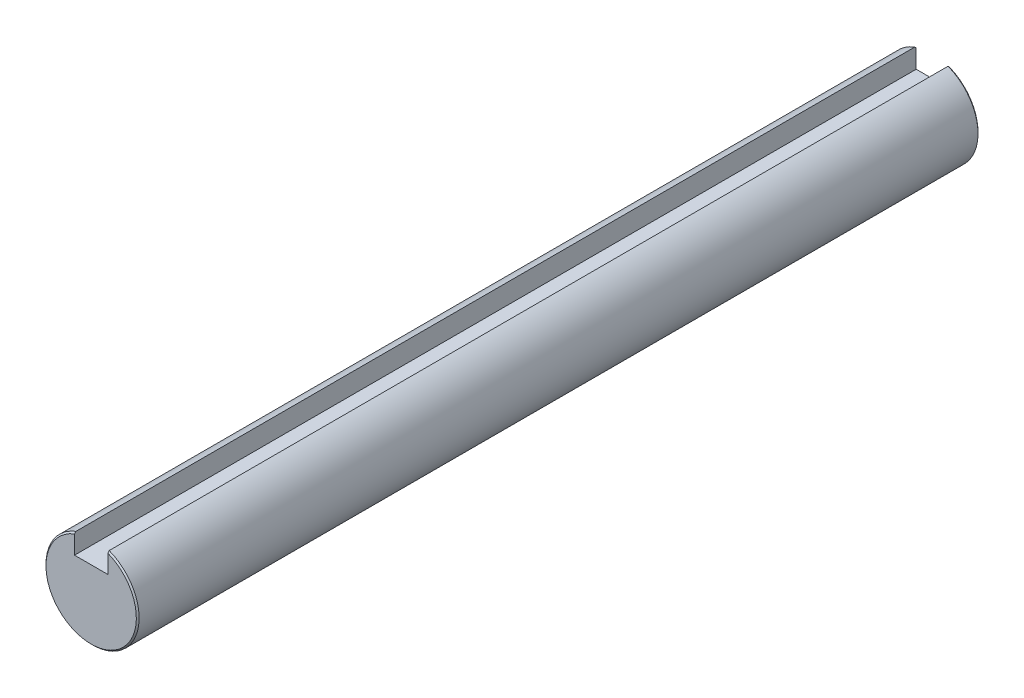
ISO-10303-21;
HEADER;
FILE_DESCRIPTION(('STEP AP214'),'2;1');
FILE_NAME('part.step','',(''),(''),'','','');
FILE_SCHEMA(('AUTOMOTIVE_DESIGN { 1 0 10303 214 1 1 1 1 }'));
ENDSEC;
DATA;
#1=APPLICATION_CONTEXT('core data for automotive mechanical design processes');
#2=APPLICATION_PROTOCOL_DEFINITION('international standard','automotive_design',2000,#1);
#3=PRODUCT_CONTEXT('',#1,'mechanical');
#4=PRODUCT('Part','Part','',(#3));
#5=PRODUCT_RELATED_PRODUCT_CATEGORY('part','',(#4));
#6=PRODUCT_DEFINITION_FORMATION('','',#4);
#7=PRODUCT_DEFINITION_CONTEXT('part definition',#1,'design');
#8=PRODUCT_DEFINITION('design','',#6,#7);
#9=PRODUCT_DEFINITION_SHAPE('','',#8);
#10=(LENGTH_UNIT() NAMED_UNIT(*) SI_UNIT(.MILLI.,.METRE.));
#11=(NAMED_UNIT(*) PLANE_ANGLE_UNIT() SI_UNIT($,.RADIAN.));
#12=(NAMED_UNIT(*) SI_UNIT($,.STERADIAN.) SOLID_ANGLE_UNIT());
#13=UNCERTAINTY_MEASURE_WITH_UNIT(LENGTH_MEASURE(1.E-05),#10,'distance_accuracy_value','');
#14=(GEOMETRIC_REPRESENTATION_CONTEXT(3) GLOBAL_UNCERTAINTY_ASSIGNED_CONTEXT((#13)) GLOBAL_UNIT_ASSIGNED_CONTEXT((#10,
#11,#12)) REPRESENTATION_CONTEXT('',''));
#15=CARTESIAN_POINT('',(0.,0.,0.));
#16=DIRECTION('',(0.,0.,1.));
#17=DIRECTION('',(1.,0.,0.));
#18=AXIS2_PLACEMENT_3D('',#15,#16,#17);
#19=CARTESIAN_POINT('',(0.,0.,63.25));
#20=DIRECTION('',(0.,0.,-1.));
#21=DIRECTION('',(-1.,0.,0.));
#22=AXIS2_PLACEMENT_3D('',#19,#20,#21);
#23=CYLINDRICAL_SURFACE('',#22,7.);
#24=DIRECTION('',(0.,0.,-1.));
#25=VECTOR('',#24,1.);
#26=CARTESIAN_POINT('',(-2.5,6.53834841531101,63.25));
#27=LINE('',#26,#25);
#28=CARTESIAN_POINT('',(-2.5,6.53834841531101,63.04));
#29=VERTEX_POINT('',#28);
#30=CARTESIAN_POINT('',(-2.5,6.53834841531101,-63.04));
#31=VERTEX_POINT('',#30);
#32=EDGE_CURVE('E133',#29,#31,#27,.T.);
#33=ORIENTED_EDGE('',*,*,#32,.T.);
#34=CARTESIAN_POINT('',(0.,0.,-63.04));
#35=DIRECTION('',(0.,0.,1.));
#36=DIRECTION('',(1.,0.,0.));
#37=AXIS2_PLACEMENT_3D('',#34,#35,#36);
#38=CIRCLE('',#37,7.);
#39=CARTESIAN_POINT('',(2.5,6.53834841531101,-63.04));
#40=VERTEX_POINT('',#39);
#41=EDGE_CURVE('E144',#31,#40,#38,.T.);
#42=ORIENTED_EDGE('',*,*,#41,.T.);
#43=DIRECTION('',(0.,0.,-1.));
#44=VECTOR('',#43,1.);
#45=CARTESIAN_POINT('',(2.5,6.53834841531101,63.25));
#46=LINE('',#45,#44);
#47=CARTESIAN_POINT('',(2.5,6.53834841531101,63.04));
#48=VERTEX_POINT('',#47);
#49=EDGE_CURVE('E115',#48,#40,#46,.T.);
#50=ORIENTED_EDGE('',*,*,#49,.F.);
#51=CARTESIAN_POINT('',(0.,0.,63.04));
#52=DIRECTION('',(0.,0.,1.));
#53=DIRECTION('',(1.,0.,0.));
#54=AXIS2_PLACEMENT_3D('',#51,#52,#53);
#55=CIRCLE('',#54,7.);
#56=EDGE_CURVE('E141',#48,#29,#55,.F.);
#57=ORIENTED_EDGE('',*,*,#56,.T.);
#58=EDGE_LOOP('',(#33,#42,#50,#57));
#59=FACE_BOUND('',#58,.T.);
#60=ADVANCED_FACE('F39',(#59),#23,.T.);
#61=CARTESIAN_POINT('',(2.5,3.53834841531101,63.25));
#62=DIRECTION('',(1.,0.,0.));
#63=DIRECTION('',(0.,0.,-1.));
#64=AXIS2_PLACEMENT_3D('',#61,#62,#63);
#65=PLANE('',#64);
#66=ORIENTED_EDGE('',*,*,#49,.T.);
#67=CARTESIAN_POINT('',(2.5,6.53834841531101,-63.04));
#68=CARTESIAN_POINT('',(2.5,6.50083232617843,-63.0750431903254));
#69=CARTESIAN_POINT('',(2.5,6.46329611171481,-63.1100647854001));
#70=CARTESIAN_POINT('',(2.5,6.38818343174731,-63.1800647854005));
#71=CARTESIAN_POINT('',(2.5,6.35060696624303,-63.2150431903258));
#72=CARTESIAN_POINT('',(2.5,6.3130103754073,-63.25));
#73=B_SPLINE_CURVE_WITH_KNOTS('',3,(#67,#68,#69,#70,#71,#72),.UNSPECIFIED.,.F.,.F.,(4,2,4),(0.,
0.15401076475527,0.308021531061483),.UNSPECIFIED.);
#74=CARTESIAN_POINT('',(2.5,6.3130103754073,-63.25));
#75=VERTEX_POINT('',#74);
#76=EDGE_CURVE('E104',#40,#75,#73,.T.);
#77=ORIENTED_EDGE('',*,*,#76,.T.);
#78=DIRECTION('',(0.,-1.,0.));
#79=VECTOR('',#78,1.);
#80=CARTESIAN_POINT('',(2.5,3.53834841531101,-63.25));
#81=LINE('',#80,#79);
#82=CARTESIAN_POINT('',(2.5,3.53834841531101,-63.25));
#83=VERTEX_POINT('',#82);
#84=EDGE_CURVE('E97',#75,#83,#81,.T.);
#85=ORIENTED_EDGE('',*,*,#84,.T.);
#86=DIRECTION('',(0.,0.,-1.));
#87=VECTOR('',#86,1.);
#88=CARTESIAN_POINT('',(2.5,3.53834841531101,63.25));
#89=LINE('',#88,#87);
#90=CARTESIAN_POINT('',(2.5,3.53834841531101,63.25));
#91=VERTEX_POINT('',#90);
#92=EDGE_CURVE('E102',#91,#83,#89,.T.);
#93=ORIENTED_EDGE('',*,*,#92,.F.);
#94=DIRECTION('',(0.,-1.,0.));
#95=VECTOR('',#94,1.);
#96=CARTESIAN_POINT('',(2.5,3.53834841531101,63.25));
#97=LINE('',#96,#95);
#98=CARTESIAN_POINT('',(2.5,6.3130103754073,63.25));
#99=VERTEX_POINT('',#98);
#100=EDGE_CURVE('E123',#99,#91,#97,.T.);
#101=ORIENTED_EDGE('',*,*,#100,.F.);
#102=CARTESIAN_POINT('',(2.5,6.3130103754073,63.25));
#103=CARTESIAN_POINT('',(2.5,6.35060696624303,63.2150431903258));
#104=CARTESIAN_POINT('',(2.5,6.38818343174731,63.1800647854005));
#105=CARTESIAN_POINT('',(2.5,6.46329611171481,63.1100647854001));
#106=CARTESIAN_POINT('',(2.5,6.50083232617843,63.0750431903254));
#107=CARTESIAN_POINT('',(2.5,6.53834841531102,63.04));
#108=B_SPLINE_CURVE_WITH_KNOTS('',3,(#102,#103,#104,#105,#106,#107),.UNSPECIFIED.,.F.,.F.,(4,2,
4),(0.,0.1540107663062,0.308021531061474),.UNSPECIFIED.);
#109=EDGE_CURVE('E148',#99,#48,#108,.T.);
#110=ORIENTED_EDGE('',*,*,#109,.T.);
#111=EDGE_LOOP('',(#66,#77,#85,#93,#101,#110));
#112=FACE_BOUND('',#111,.T.);
#113=ADVANCED_FACE('F100',(#112),#65,.F.);
#114=CARTESIAN_POINT('',(2.5,3.53834841531101,63.25));
#115=DIRECTION('',(0.,-1.,0.));
#116=DIRECTION('',(1.,0.,0.));
#117=AXIS2_PLACEMENT_3D('',#114,#115,#116);
#118=PLANE('',#117);
#119=ORIENTED_EDGE('',*,*,#92,.T.);
#120=DIRECTION('',(-1.,0.,0.));
#121=VECTOR('',#120,1.);
#122=CARTESIAN_POINT('',(2.5,3.53834841531101,-63.25));
#123=LINE('',#122,#121);
#124=CARTESIAN_POINT('',(-2.5,3.53834841531101,-63.25));
#125=VERTEX_POINT('',#124);
#126=EDGE_CURVE('E107',#83,#125,#123,.T.);
#127=ORIENTED_EDGE('',*,*,#126,.T.);
#128=DIRECTION('',(0.,0.,-1.));
#129=VECTOR('',#128,1.);
#130=CARTESIAN_POINT('',(-2.5,3.53834841531101,63.25));
#131=LINE('',#130,#129);
#132=CARTESIAN_POINT('',(-2.5,3.53834841531101,63.25));
#133=VERTEX_POINT('',#132);
#134=EDGE_CURVE('E116',#133,#125,#131,.T.);
#135=ORIENTED_EDGE('',*,*,#134,.F.);
#136=DIRECTION('',(-1.,0.,0.));
#137=VECTOR('',#136,1.);
#138=CARTESIAN_POINT('',(2.5,3.53834841531101,63.25));
#139=LINE('',#138,#137);
#140=EDGE_CURVE('E113',#91,#133,#139,.T.);
#141=ORIENTED_EDGE('',*,*,#140,.F.);
#142=EDGE_LOOP('',(#119,#127,#135,#141));
#143=FACE_BOUND('',#142,.T.);
#144=ADVANCED_FACE('F111',(#143),#118,.F.);
#145=CARTESIAN_POINT('',(-2.5,3.53834841531101,63.25));
#146=DIRECTION('',(-1.,0.,0.));
#147=DIRECTION('',(0.,0.,1.));
#148=AXIS2_PLACEMENT_3D('',#145,#146,#147);
#149=PLANE('',#148);
#150=DIRECTION('',(0.,1.,0.));
#151=VECTOR('',#150,1.);
#152=CARTESIAN_POINT('',(-2.5,3.53834841531101,-63.25));
#153=LINE('',#152,#151);
#154=CARTESIAN_POINT('',(-2.5,6.3130103754073,-63.25));
#155=VERTEX_POINT('',#154);
#156=EDGE_CURVE('E119',#125,#155,#153,.T.);
#157=ORIENTED_EDGE('',*,*,#156,.T.);
#158=CARTESIAN_POINT('',(-2.5,6.3130103754073,-63.25));
#159=CARTESIAN_POINT('',(-2.5,6.35060696624303,-63.2150431903258));
#160=CARTESIAN_POINT('',(-2.5,6.38818343174732,-63.1800647854005));
#161=CARTESIAN_POINT('',(-2.5,6.46329611171482,-63.1100647854001));
#162=CARTESIAN_POINT('',(-2.5,6.50083232617843,-63.0750431903254));
#163=CARTESIAN_POINT('',(-2.5,6.53834841531101,-63.04));
#164=B_SPLINE_CURVE_WITH_KNOTS('',3,(#158,#159,#160,#161,#162,#163),.UNSPECIFIED.,.F.,.F.,(4,2,
4),(0.,0.154010766306212,0.308021531061483),.UNSPECIFIED.);
#165=EDGE_CURVE('E49',#155,#31,#164,.T.);
#166=ORIENTED_EDGE('',*,*,#165,.T.);
#167=ORIENTED_EDGE('',*,*,#32,.F.);
#168=CARTESIAN_POINT('',(-2.5,6.53834841531101,63.04));
#169=CARTESIAN_POINT('',(-2.5,6.50083232617843,63.0750431903254));
#170=CARTESIAN_POINT('',(-2.5,6.46329611171481,63.1100647854001));
#171=CARTESIAN_POINT('',(-2.5,6.38818343174731,63.1800647854005));
#172=CARTESIAN_POINT('',(-2.5,6.35060696624302,63.2150431903258));
#173=CARTESIAN_POINT('',(-2.5,6.3130103754073,63.25));
#174=B_SPLINE_CURVE_WITH_KNOTS('',3,(#168,#169,#170,#171,#172,#173),.UNSPECIFIED.,.F.,.F.,(4,2,
4),(0.,0.154010764755273,0.308021531061475),.UNSPECIFIED.);
#175=CARTESIAN_POINT('',(-2.5,6.3130103754073,63.25));
#176=VERTEX_POINT('',#175);
#177=EDGE_CURVE('E56',#29,#176,#174,.T.);
#178=ORIENTED_EDGE('',*,*,#177,.T.);
#179=DIRECTION('',(0.,1.,0.));
#180=VECTOR('',#179,1.);
#181=CARTESIAN_POINT('',(-2.5,3.53834841531101,63.25));
#182=LINE('',#181,#180);
#183=EDGE_CURVE('E130',#133,#176,#182,.T.);
#184=ORIENTED_EDGE('',*,*,#183,.F.);
#185=ORIENTED_EDGE('',*,*,#134,.T.);
#186=EDGE_LOOP('',(#157,#166,#167,#178,#184,#185));
#187=FACE_BOUND('',#186,.T.);
#188=ADVANCED_FACE('F184',(#187),#149,.F.);
#189=CARTESIAN_POINT('',(0.,0.,63.25));
#190=DIRECTION('',(0.,0.,1.));
#191=DIRECTION('',(1.,0.,0.));
#192=AXIS2_PLACEMENT_3D('',#189,#190,#191);
#193=PLANE('',#192);
#194=ORIENTED_EDGE('',*,*,#183,.T.);
#195=CARTESIAN_POINT('',(0.,0.,63.25));
#196=DIRECTION('',(0.,0.,1.));
#197=DIRECTION('',(1.,0.,0.));
#198=AXIS2_PLACEMENT_3D('',#195,#196,#197);
#199=CIRCLE('',#198,6.79000000000002);
#200=EDGE_CURVE('E11',#176,#99,#199,.T.);
#201=ORIENTED_EDGE('',*,*,#200,.T.);
#202=ORIENTED_EDGE('',*,*,#100,.T.);
#203=ORIENTED_EDGE('',*,*,#140,.T.);
#204=EDGE_LOOP('',(#194,#201,#202,#203));
#205=FACE_BOUND('',#204,.T.);
#206=ADVANCED_FACE('F188',(#205),#193,.T.);
#207=CARTESIAN_POINT('',(0.,0.,-63.25));
#208=DIRECTION('',(0.,0.,1.));
#209=DIRECTION('',(1.,0.,0.));
#210=AXIS2_PLACEMENT_3D('',#207,#208,#209);
#211=PLANE('',#210);
#212=ORIENTED_EDGE('',*,*,#84,.F.);
#213=CARTESIAN_POINT('',(0.,0.,-63.25));
#214=DIRECTION('',(0.,0.,1.));
#215=DIRECTION('',(1.,0.,0.));
#216=AXIS2_PLACEMENT_3D('',#213,#214,#215);
#217=CIRCLE('',#216,6.79000000000002);
#218=EDGE_CURVE('E64',#75,#155,#217,.F.);
#219=ORIENTED_EDGE('',*,*,#218,.T.);
#220=ORIENTED_EDGE('',*,*,#156,.F.);
#221=ORIENTED_EDGE('',*,*,#126,.F.);
#222=EDGE_LOOP('',(#212,#219,#220,#221));
#223=FACE_BOUND('',#222,.T.);
#224=ADVANCED_FACE('F118',(#223),#211,.F.);
#225=CARTESIAN_POINT('',(0.,0.,-63.04));
#226=DIRECTION('',(0.,0.,1.));
#227=DIRECTION('',(1.,0.,0.));
#228=AXIS2_PLACEMENT_3D('',#225,#226,#227);
#229=CONICAL_SURFACE('',#228,7.,0.78539816339744);
#230=ORIENTED_EDGE('',*,*,#165,.F.);
#231=ORIENTED_EDGE('',*,*,#218,.F.);
#232=ORIENTED_EDGE('',*,*,#76,.F.);
#233=ORIENTED_EDGE('',*,*,#41,.F.);
#234=EDGE_LOOP('',(#230,#231,#232,#233));
#235=FACE_BOUND('',#234,.T.);
#236=ADVANCED_FACE('F169',(#235),#229,.T.);
#237=CARTESIAN_POINT('',(0.,0.,63.25));
#238=DIRECTION('',(0.,0.,-1.));
#239=DIRECTION('',(-1.,0.,0.));
#240=AXIS2_PLACEMENT_3D('',#237,#238,#239);
#241=CONICAL_SURFACE('',#240,6.79000000000002,0.785398163397475);
#242=ORIENTED_EDGE('',*,*,#177,.F.);
#243=ORIENTED_EDGE('',*,*,#56,.F.);
#244=ORIENTED_EDGE('',*,*,#109,.F.);
#245=ORIENTED_EDGE('',*,*,#200,.F.);
#246=EDGE_LOOP('',(#242,#243,#244,#245));
#247=FACE_BOUND('',#246,.T.);
#248=ADVANCED_FACE('F41',(#247),#241,.T.);
#249=CLOSED_SHELL('',(#60,#113,#144,#188,#206,#224,#236,#248));
#250=MANIFOLD_SOLID_BREP('B2',#249);
#251=ADVANCED_BREP_SHAPE_REPRESENTATION('',(#18,#250),#14);
#252=SHAPE_DEFINITION_REPRESENTATION(#9,#251);
ENDSEC;
END-ISO-10303-21;
